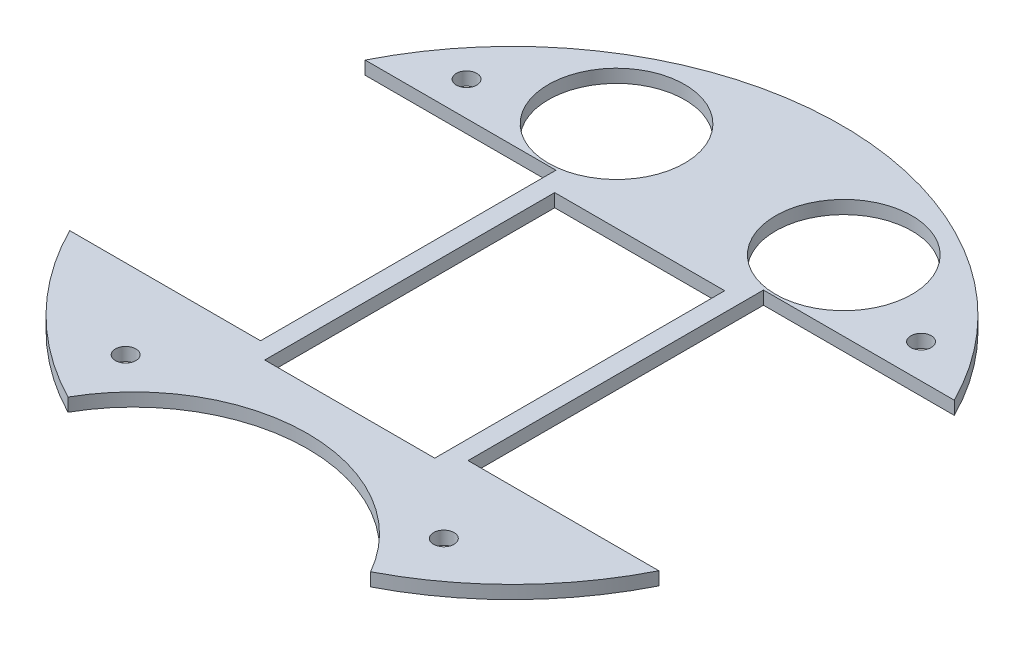
ISO-10303-21;
HEADER;
FILE_DESCRIPTION(('STEP AP214'),'2;1');
FILE_NAME('part.step','',(''),(''),'','','');
FILE_SCHEMA(('AUTOMOTIVE_DESIGN { 1 0 10303 214 1 1 1 1 }'));
ENDSEC;
DATA;
#1=APPLICATION_CONTEXT('core data for automotive mechanical design processes');
#2=APPLICATION_PROTOCOL_DEFINITION('international standard','automotive_design',2000,#1);
#3=PRODUCT_CONTEXT('',#1,'mechanical');
#4=PRODUCT('Part','Part','',(#3));
#5=PRODUCT_RELATED_PRODUCT_CATEGORY('part','',(#4));
#6=PRODUCT_DEFINITION_FORMATION('','',#4);
#7=PRODUCT_DEFINITION_CONTEXT('part definition',#1,'design');
#8=PRODUCT_DEFINITION('design','',#6,#7);
#9=PRODUCT_DEFINITION_SHAPE('','',#8);
#10=(LENGTH_UNIT() NAMED_UNIT(*) SI_UNIT(.MILLI.,.METRE.));
#11=(NAMED_UNIT(*) PLANE_ANGLE_UNIT() SI_UNIT($,.RADIAN.));
#12=(NAMED_UNIT(*) SI_UNIT($,.STERADIAN.) SOLID_ANGLE_UNIT());
#13=UNCERTAINTY_MEASURE_WITH_UNIT(LENGTH_MEASURE(1.E-05),#10,'distance_accuracy_value','');
#14=(GEOMETRIC_REPRESENTATION_CONTEXT(3) GLOBAL_UNCERTAINTY_ASSIGNED_CONTEXT((#13)) GLOBAL_UNIT_ASSIGNED_CONTEXT((#10,
#11,#12)) REPRESENTATION_CONTEXT('',''));
#15=CARTESIAN_POINT('',(0.,0.,0.));
#16=DIRECTION('',(0.,0.,1.));
#17=DIRECTION('',(1.,0.,0.));
#18=AXIS2_PLACEMENT_3D('',#15,#16,#17);
#19=CARTESIAN_POINT('',(0.,2.9,0.));
#20=DIRECTION('',(0.,-1.,0.));
#21=DIRECTION('',(0.,0.,-1.));
#22=AXIS2_PLACEMENT_3D('',#19,#20,#21);
#23=CYLINDRICAL_SURFACE('',#22,72.5);
#24=CARTESIAN_POINT('',(0.,0.,0.));
#25=DIRECTION('',(0.,1.,0.));
#26=DIRECTION('',(0.,0.,1.));
#27=AXIS2_PLACEMENT_3D('',#24,#25,#26);
#28=CIRCLE('',#27,72.5);
#29=CARTESIAN_POINT('',(33.2911053697012,0.,64.4045984636458));
#30=VERTEX_POINT('',#29);
#31=CARTESIAN_POINT('',(64.8074069840786,0.,32.4999999999999));
#32=VERTEX_POINT('',#31);
#33=EDGE_CURVE('E156',#30,#32,#28,.T.);
#34=ORIENTED_EDGE('',*,*,#33,.T.);
#35=DIRECTION('',(0.,1.,0.));
#36=VECTOR('',#35,1.);
#37=CARTESIAN_POINT('',(64.8074069840786,0.,32.4999999999999));
#38=LINE('',#37,#36);
#39=CARTESIAN_POINT('',(64.8074069840786,2.9,32.4999999999999));
#40=VERTEX_POINT('',#39);
#41=EDGE_CURVE('E231',#32,#40,#38,.T.);
#42=ORIENTED_EDGE('',*,*,#41,.T.);
#43=CARTESIAN_POINT('',(0.,2.9,0.));
#44=DIRECTION('',(0.,1.,0.));
#45=DIRECTION('',(0.,0.,1.));
#46=AXIS2_PLACEMENT_3D('',#43,#44,#45);
#47=CIRCLE('',#46,72.5);
#48=CARTESIAN_POINT('',(33.2911053697012,2.9,64.4045984636458));
#49=VERTEX_POINT('',#48);
#50=EDGE_CURVE('E165',#49,#40,#47,.T.);
#51=ORIENTED_EDGE('',*,*,#50,.F.);
#52=DIRECTION('',(0.,-1.,0.));
#53=VECTOR('',#52,1.);
#54=CARTESIAN_POINT('',(33.2911053697012,2.9,64.4045984636458));
#55=LINE('',#54,#53);
#56=EDGE_CURVE('E11',#49,#30,#55,.T.);
#57=ORIENTED_EDGE('',*,*,#56,.T.);
#58=EDGE_LOOP('',(#34,#42,#51,#57));
#59=FACE_BOUND('',#58,.T.);
#60=ADVANCED_FACE('F32',(#59),#23,.T.);
#61=CARTESIAN_POINT('',(64.8074069840786,2.9,-32.5));
#62=VERTEX_POINT('',#61);
#63=CARTESIAN_POINT('',(-64.8074069840786,2.9,-32.5));
#64=VERTEX_POINT('',#63);
#65=EDGE_CURVE('E149',#62,#64,#47,.T.);
#66=ORIENTED_EDGE('',*,*,#65,.F.);
#67=DIRECTION('',(0.,1.,0.));
#68=VECTOR('',#67,1.);
#69=CARTESIAN_POINT('',(64.8074069840786,0.,-32.5));
#70=LINE('',#69,#68);
#71=CARTESIAN_POINT('',(64.8074069840786,0.,-32.5));
#72=VERTEX_POINT('',#71);
#73=EDGE_CURVE('E136',#72,#62,#70,.T.);
#74=ORIENTED_EDGE('',*,*,#73,.F.);
#75=CARTESIAN_POINT('',(-64.8074069840786,0.,-32.5));
#76=VERTEX_POINT('',#75);
#77=EDGE_CURVE('E147',#72,#76,#28,.T.);
#78=ORIENTED_EDGE('',*,*,#77,.T.);
#79=DIRECTION('',(0.,1.,0.));
#80=VECTOR('',#79,1.);
#81=CARTESIAN_POINT('',(-64.8074069840786,0.,-32.5));
#82=LINE('',#81,#80);
#83=EDGE_CURVE('E218',#76,#64,#82,.T.);
#84=ORIENTED_EDGE('',*,*,#83,.T.);
#85=EDGE_LOOP('',(#66,#74,#78,#84));
#86=FACE_BOUND('',#85,.T.);
#87=ADVANCED_FACE('F145',(#86),#23,.T.);
#88=CARTESIAN_POINT('',(0.,2.9,83.2397996376034));
#89=DIRECTION('',(0.,-1.,0.));
#90=DIRECTION('',(0.,0.,-1.));
#91=AXIS2_PLACEMENT_3D('',#88,#89,#90);
#92=CYLINDRICAL_SURFACE('',#91,38.25);
#93=CARTESIAN_POINT('',(0.,0.,83.2397996376034));
#94=DIRECTION('',(0.,-1.,0.));
#95=DIRECTION('',(0.,0.,1.));
#96=AXIS2_PLACEMENT_3D('',#93,#94,#95);
#97=CIRCLE('',#96,38.25);
#98=CARTESIAN_POINT('',(-33.2911053697012,0.,64.4045984636458));
#99=VERTEX_POINT('',#98);
#100=EDGE_CURVE('E161',#99,#30,#97,.T.);
#101=ORIENTED_EDGE('',*,*,#100,.T.);
#102=ORIENTED_EDGE('',*,*,#56,.F.);
#103=CARTESIAN_POINT('',(0.,2.9,83.2397996376034));
#104=DIRECTION('',(0.,-1.,0.));
#105=DIRECTION('',(0.,0.,1.));
#106=AXIS2_PLACEMENT_3D('',#103,#104,#105);
#107=CIRCLE('',#106,38.25);
#108=CARTESIAN_POINT('',(-33.2911053697012,2.9,64.4045984636458));
#109=VERTEX_POINT('',#108);
#110=EDGE_CURVE('E160',#109,#49,#107,.T.);
#111=ORIENTED_EDGE('',*,*,#110,.F.);
#112=DIRECTION('',(0.,-1.,0.));
#113=VECTOR('',#112,1.);
#114=CARTESIAN_POINT('',(-33.2911053697012,2.9,64.4045984636458));
#115=LINE('',#114,#113);
#116=EDGE_CURVE('E40',#109,#99,#115,.T.);
#117=ORIENTED_EDGE('',*,*,#116,.T.);
#118=EDGE_LOOP('',(#101,#102,#111,#117));
#119=FACE_BOUND('',#118,.T.);
#120=ADVANCED_FACE('F34',(#119),#92,.F.);
#121=CARTESIAN_POINT('',(-64.8074069840786,2.9,32.4999999999999));
#122=VERTEX_POINT('',#121);
#123=EDGE_CURVE('E172',#122,#109,#47,.T.);
#124=ORIENTED_EDGE('',*,*,#123,.F.);
#125=DIRECTION('',(0.,1.,0.));
#126=VECTOR('',#125,1.);
#127=CARTESIAN_POINT('',(-64.8074069840786,0.,32.4999999999999));
#128=LINE('',#127,#126);
#129=CARTESIAN_POINT('',(-64.8074069840786,0.,32.4999999999999));
#130=VERTEX_POINT('',#129);
#131=EDGE_CURVE('E203',#130,#122,#128,.T.);
#132=ORIENTED_EDGE('',*,*,#131,.F.);
#133=EDGE_CURVE('E157',#130,#99,#28,.T.);
#134=ORIENTED_EDGE('',*,*,#133,.T.);
#135=ORIENTED_EDGE('',*,*,#116,.F.);
#136=EDGE_LOOP('',(#124,#132,#134,#135));
#137=FACE_BOUND('',#136,.T.);
#138=ADVANCED_FACE('F299',(#137),#23,.T.);
#139=CARTESIAN_POINT('',(0.,2.9,41.6198998188017));
#140=DIRECTION('',(0.,1.,0.));
#141=DIRECTION('',(0.,0.,1.));
#142=AXIS2_PLACEMENT_3D('',#139,#140,#141);
#143=PLANE('',#142);
#144=CARTESIAN_POINT('',(-35.,2.9,50.));
#145=DIRECTION('',(0.,1.,0.));
#146=DIRECTION('',(0.,0.,1.));
#147=AXIS2_PLACEMENT_3D('',#144,#145,#146);
#148=CIRCLE('',#147,2.25);
#149=CARTESIAN_POINT('',(-35.,2.9,52.25));
#150=VERTEX_POINT('',#149);
#151=EDGE_CURVE('E281',#150,#150,#148,.T.);
#152=ORIENTED_EDGE('',*,*,#151,.F.);
#153=EDGE_LOOP('',(#152));
#154=FACE_BOUND('',#153,.T.);
#155=CARTESIAN_POINT('',(-50.,2.9,-40.));
#156=DIRECTION('',(0.,1.,0.));
#157=DIRECTION('',(0.,0.,1.));
#158=AXIS2_PLACEMENT_3D('',#155,#156,#157);
#159=CIRCLE('',#158,2.25);
#160=CARTESIAN_POINT('',(-50.,2.9,-37.75));
#161=VERTEX_POINT('',#160);
#162=EDGE_CURVE('E275',#161,#161,#159,.T.);
#163=ORIENTED_EDGE('',*,*,#162,.F.);
#164=EDGE_LOOP('',(#163));
#165=FACE_BOUND('',#164,.T.);
#166=CARTESIAN_POINT('',(50.,2.9,-40.));
#167=DIRECTION('',(0.,1.,0.));
#168=DIRECTION('',(0.,0.,1.));
#169=AXIS2_PLACEMENT_3D('',#166,#167,#168);
#170=CIRCLE('',#169,2.25);
#171=CARTESIAN_POINT('',(50.,2.9,-37.75));
#172=VERTEX_POINT('',#171);
#173=EDGE_CURVE('E269',#172,#172,#170,.T.);
#174=ORIENTED_EDGE('',*,*,#173,.F.);
#175=EDGE_LOOP('',(#174));
#176=FACE_BOUND('',#175,.T.);
#177=CARTESIAN_POINT('',(35.,2.9,50.));
#178=DIRECTION('',(0.,1.,0.));
#179=DIRECTION('',(0.,0.,1.));
#180=AXIS2_PLACEMENT_3D('',#177,#178,#179);
#181=CIRCLE('',#180,2.25);
#182=CARTESIAN_POINT('',(35.,2.9,52.25));
#183=VERTEX_POINT('',#182);
#184=EDGE_CURVE('E263',#183,#183,#181,.T.);
#185=ORIENTED_EDGE('',*,*,#184,.F.);
#186=EDGE_LOOP('',(#185));
#187=FACE_BOUND('',#186,.T.);
#188=CARTESIAN_POINT('',(-25.,2.9,-48.));
#189=DIRECTION('',(0.,1.,0.));
#190=DIRECTION('',(0.,0.,1.));
#191=AXIS2_PLACEMENT_3D('',#188,#189,#190);
#192=CIRCLE('',#191,15.);
#193=CARTESIAN_POINT('',(-25.,2.9,-33.));
#194=VERTEX_POINT('',#193);
#195=EDGE_CURVE('E257',#194,#194,#192,.T.);
#196=ORIENTED_EDGE('',*,*,#195,.F.);
#197=EDGE_LOOP('',(#196));
#198=FACE_BOUND('',#197,.T.);
#199=CARTESIAN_POINT('',(25.,2.9,-48.));
#200=DIRECTION('',(0.,1.,0.));
#201=DIRECTION('',(0.,0.,1.));
#202=AXIS2_PLACEMENT_3D('',#199,#200,#201);
#203=CIRCLE('',#202,15.);
#204=CARTESIAN_POINT('',(25.,2.9,-33.));
#205=VERTEX_POINT('',#204);
#206=EDGE_CURVE('E251',#205,#205,#203,.T.);
#207=ORIENTED_EDGE('',*,*,#206,.F.);
#208=EDGE_LOOP('',(#207));
#209=FACE_BOUND('',#208,.T.);
#210=DIRECTION('',(1.,0.,0.));
#211=VECTOR('',#210,1.);
#212=CARTESIAN_POINT('',(64.8074069840786,2.9,32.4999999999999));
#213=LINE('',#212,#211);
#214=CARTESIAN_POINT('',(22.8299999999999,2.9,32.4999999999999));
#215=VERTEX_POINT('',#214);
#216=EDGE_CURVE('E141',#215,#40,#213,.T.);
#217=ORIENTED_EDGE('',*,*,#216,.F.);
#218=DIRECTION('',(0.,0.,1.));
#219=VECTOR('',#218,1.);
#220=CARTESIAN_POINT('',(22.8299999999999,2.9,32.4999999999999));
#221=LINE('',#220,#219);
#222=CARTESIAN_POINT('',(22.8299999999999,2.9,-32.5));
#223=VERTEX_POINT('',#222);
#224=EDGE_CURVE('E242',#223,#215,#221,.T.);
#225=ORIENTED_EDGE('',*,*,#224,.F.);
#226=DIRECTION('',(-1.,0.,0.));
#227=VECTOR('',#226,1.);
#228=CARTESIAN_POINT('',(64.8074069840786,2.9,-32.5));
#229=LINE('',#228,#227);
#230=EDGE_CURVE('E245',#62,#223,#229,.T.);
#231=ORIENTED_EDGE('',*,*,#230,.F.);
#232=ORIENTED_EDGE('',*,*,#65,.T.);
#233=DIRECTION('',(-1.,0.,0.));
#234=VECTOR('',#233,1.);
#235=CARTESIAN_POINT('',(-64.8074069840786,2.9,-32.5));
#236=LINE('',#235,#234);
#237=CARTESIAN_POINT('',(-22.8299999999999,2.9,-32.5));
#238=VERTEX_POINT('',#237);
#239=EDGE_CURVE('E221',#238,#64,#236,.T.);
#240=ORIENTED_EDGE('',*,*,#239,.F.);
#241=DIRECTION('',(0.,0.,-1.));
#242=VECTOR('',#241,1.);
#243=CARTESIAN_POINT('',(-22.8299999999999,2.9,32.4999999999999));
#244=LINE('',#243,#242);
#245=CARTESIAN_POINT('',(-22.8299999999999,2.9,32.4999999999999));
#246=VERTEX_POINT('',#245);
#247=EDGE_CURVE('E225',#246,#238,#244,.T.);
#248=ORIENTED_EDGE('',*,*,#247,.F.);
#249=DIRECTION('',(1.,0.,0.));
#250=VECTOR('',#249,1.);
#251=CARTESIAN_POINT('',(-34.6299999999999,2.9,32.5));
#252=LINE('',#251,#250);
#253=EDGE_CURVE('E228',#122,#246,#252,.T.);
#254=ORIENTED_EDGE('',*,*,#253,.F.);
#255=ORIENTED_EDGE('',*,*,#123,.T.);
#256=ORIENTED_EDGE('',*,*,#110,.T.);
#257=ORIENTED_EDGE('',*,*,#50,.T.);
#258=EDGE_LOOP('',(#217,#225,#231,#232,#240,#248,#254,#255,#256,#257));
#259=FACE_BOUND('',#258,.T.);
#260=DIRECTION('',(0.,0.,1.));
#261=VECTOR('',#260,1.);
#262=CARTESIAN_POINT('',(-18.7,2.9,35.7));
#263=LINE('',#262,#261);
#264=CARTESIAN_POINT('',(-18.7,2.9,-28.1));
#265=VERTEX_POINT('',#264);
#266=CARTESIAN_POINT('',(-18.7,2.9,35.7));
#267=VERTEX_POINT('',#266);
#268=EDGE_CURVE('E201',#265,#267,#263,.T.);
#269=ORIENTED_EDGE('',*,*,#268,.F.);
#270=DIRECTION('',(-1.,0.,0.));
#271=VECTOR('',#270,1.);
#272=CARTESIAN_POINT('',(-18.7,2.9,-28.1));
#273=LINE('',#272,#271);
#274=CARTESIAN_POINT('',(18.7,2.9,-28.1));
#275=VERTEX_POINT('',#274);
#276=EDGE_CURVE('E191',#275,#265,#273,.T.);
#277=ORIENTED_EDGE('',*,*,#276,.F.);
#278=DIRECTION('',(0.,0.,-1.));
#279=VECTOR('',#278,1.);
#280=CARTESIAN_POINT('',(18.7,2.9,35.7));
#281=LINE('',#280,#279);
#282=CARTESIAN_POINT('',(18.7,2.9,35.7));
#283=VERTEX_POINT('',#282);
#284=EDGE_CURVE('E195',#283,#275,#281,.T.);
#285=ORIENTED_EDGE('',*,*,#284,.F.);
#286=DIRECTION('',(1.,0.,0.));
#287=VECTOR('',#286,1.);
#288=CARTESIAN_POINT('',(-18.7,2.9,35.7));
#289=LINE('',#288,#287);
#290=EDGE_CURVE('E198',#267,#283,#289,.T.);
#291=ORIENTED_EDGE('',*,*,#290,.F.);
#292=EDGE_LOOP('',(#269,#277,#285,#291));
#293=FACE_BOUND('',#292,.T.);
#294=ADVANCED_FACE('F296',(#154,#165,#176,#187,#198,#209,#259,#293),#143,.T.);
#295=CARTESIAN_POINT('',(0.,0.,41.6198998188017));
#296=DIRECTION('',(0.,1.,0.));
#297=DIRECTION('',(0.,0.,1.));
#298=AXIS2_PLACEMENT_3D('',#295,#296,#297);
#299=PLANE('',#298);
#300=CARTESIAN_POINT('',(-35.,0.,50.));
#301=DIRECTION('',(0.,1.,0.));
#302=DIRECTION('',(0.,0.,1.));
#303=AXIS2_PLACEMENT_3D('',#300,#301,#302);
#304=CIRCLE('',#303,2.25);
#305=CARTESIAN_POINT('',(-35.,0.,52.25));
#306=VERTEX_POINT('',#305);
#307=EDGE_CURVE('E266',#306,#306,#304,.T.);
#308=ORIENTED_EDGE('',*,*,#307,.T.);
#309=EDGE_LOOP('',(#308));
#310=FACE_BOUND('',#309,.T.);
#311=CARTESIAN_POINT('',(-50.,0.,-40.));
#312=DIRECTION('',(0.,1.,0.));
#313=DIRECTION('',(0.,0.,1.));
#314=AXIS2_PLACEMENT_3D('',#311,#312,#313);
#315=CIRCLE('',#314,2.25);
#316=CARTESIAN_POINT('',(-50.,0.,-37.75));
#317=VERTEX_POINT('',#316);
#318=EDGE_CURVE('E278',#317,#317,#315,.T.);
#319=ORIENTED_EDGE('',*,*,#318,.T.);
#320=EDGE_LOOP('',(#319));
#321=FACE_BOUND('',#320,.T.);
#322=CARTESIAN_POINT('',(50.,0.,-40.));
#323=DIRECTION('',(0.,1.,0.));
#324=DIRECTION('',(0.,0.,1.));
#325=AXIS2_PLACEMENT_3D('',#322,#323,#324);
#326=CIRCLE('',#325,2.25);
#327=CARTESIAN_POINT('',(50.,0.,-37.75));
#328=VERTEX_POINT('',#327);
#329=EDGE_CURVE('E272',#328,#328,#326,.T.);
#330=ORIENTED_EDGE('',*,*,#329,.T.);
#331=EDGE_LOOP('',(#330));
#332=FACE_BOUND('',#331,.T.);
#333=CARTESIAN_POINT('',(35.,0.,50.));
#334=DIRECTION('',(0.,1.,0.));
#335=DIRECTION('',(0.,0.,1.));
#336=AXIS2_PLACEMENT_3D('',#333,#334,#335);
#337=CIRCLE('',#336,2.25);
#338=CARTESIAN_POINT('',(35.,0.,52.25));
#339=VERTEX_POINT('',#338);
#340=EDGE_CURVE('E260',#339,#339,#337,.T.);
#341=ORIENTED_EDGE('',*,*,#340,.T.);
#342=EDGE_LOOP('',(#341));
#343=FACE_BOUND('',#342,.T.);
#344=CARTESIAN_POINT('',(-25.,0.,-48.));
#345=DIRECTION('',(0.,1.,0.));
#346=DIRECTION('',(0.,0.,1.));
#347=AXIS2_PLACEMENT_3D('',#344,#345,#346);
#348=CIRCLE('',#347,15.);
#349=CARTESIAN_POINT('',(-25.,0.,-33.));
#350=VERTEX_POINT('',#349);
#351=EDGE_CURVE('E254',#350,#350,#348,.T.);
#352=ORIENTED_EDGE('',*,*,#351,.T.);
#353=EDGE_LOOP('',(#352));
#354=FACE_BOUND('',#353,.T.);
#355=CARTESIAN_POINT('',(25.,0.,-48.));
#356=DIRECTION('',(0.,1.,0.));
#357=DIRECTION('',(0.,0.,1.));
#358=AXIS2_PLACEMENT_3D('',#355,#356,#357);
#359=CIRCLE('',#358,15.);
#360=CARTESIAN_POINT('',(25.,0.,-33.));
#361=VERTEX_POINT('',#360);
#362=EDGE_CURVE('E247',#361,#361,#359,.T.);
#363=ORIENTED_EDGE('',*,*,#362,.T.);
#364=EDGE_LOOP('',(#363));
#365=FACE_BOUND('',#364,.T.);
#366=DIRECTION('',(-1.,0.,0.));
#367=VECTOR('',#366,1.);
#368=CARTESIAN_POINT('',(-18.7,0.,-28.1));
#369=LINE('',#368,#367);
#370=CARTESIAN_POINT('',(18.7,0.,-28.1));
#371=VERTEX_POINT('',#370);
#372=CARTESIAN_POINT('',(-18.7,0.,-28.1));
#373=VERTEX_POINT('',#372);
#374=EDGE_CURVE('E185',#371,#373,#369,.T.);
#375=ORIENTED_EDGE('',*,*,#374,.T.);
#376=DIRECTION('',(0.,0.,1.));
#377=VECTOR('',#376,1.);
#378=CARTESIAN_POINT('',(-18.7,0.,35.7));
#379=LINE('',#378,#377);
#380=CARTESIAN_POINT('',(-18.7,0.,35.7));
#381=VERTEX_POINT('',#380);
#382=EDGE_CURVE('E194',#373,#381,#379,.T.);
#383=ORIENTED_EDGE('',*,*,#382,.T.);
#384=DIRECTION('',(1.,0.,0.));
#385=VECTOR('',#384,1.);
#386=CARTESIAN_POINT('',(-18.7,0.,35.7));
#387=LINE('',#386,#385);
#388=CARTESIAN_POINT('',(18.7,0.,35.7));
#389=VERTEX_POINT('',#388);
#390=EDGE_CURVE('E209',#381,#389,#387,.T.);
#391=ORIENTED_EDGE('',*,*,#390,.T.);
#392=DIRECTION('',(0.,0.,-1.));
#393=VECTOR('',#392,1.);
#394=CARTESIAN_POINT('',(18.7,0.,35.7));
#395=LINE('',#394,#393);
#396=EDGE_CURVE('E206',#389,#371,#395,.T.);
#397=ORIENTED_EDGE('',*,*,#396,.T.);
#398=EDGE_LOOP('',(#375,#383,#391,#397));
#399=FACE_BOUND('',#398,.T.);
#400=DIRECTION('',(0.,0.,1.));
#401=VECTOR('',#400,1.);
#402=CARTESIAN_POINT('',(22.8299999999999,0.,32.4999999999999));
#403=LINE('',#402,#401);
#404=CARTESIAN_POINT('',(22.8299999999999,0.,-32.5));
#405=VERTEX_POINT('',#404);
#406=CARTESIAN_POINT('',(22.8299999999999,0.,32.4999999999999));
#407=VERTEX_POINT('',#406);
#408=EDGE_CURVE('E47',#405,#407,#403,.T.);
#409=ORIENTED_EDGE('',*,*,#408,.T.);
#410=DIRECTION('',(1.,0.,0.));
#411=VECTOR('',#410,1.);
#412=CARTESIAN_POINT('',(34.6299999999999,0.,32.5));
#413=LINE('',#412,#411);
#414=EDGE_CURVE('E150',#407,#32,#413,.T.);
#415=ORIENTED_EDGE('',*,*,#414,.T.);
#416=ORIENTED_EDGE('',*,*,#33,.F.);
#417=ORIENTED_EDGE('',*,*,#100,.F.);
#418=ORIENTED_EDGE('',*,*,#133,.F.);
#419=DIRECTION('',(1.,0.,0.));
#420=VECTOR('',#419,1.);
#421=CARTESIAN_POINT('',(-64.8074069840786,0.,32.4999999999999));
#422=LINE('',#421,#420);
#423=CARTESIAN_POINT('',(-22.8299999999999,0.,32.4999999999999));
#424=VERTEX_POINT('',#423);
#425=EDGE_CURVE('E224',#130,#424,#422,.T.);
#426=ORIENTED_EDGE('',*,*,#425,.T.);
#427=DIRECTION('',(0.,0.,-1.));
#428=VECTOR('',#427,1.);
#429=CARTESIAN_POINT('',(-22.8299999999999,0.,32.4999999999999));
#430=LINE('',#429,#428);
#431=CARTESIAN_POINT('',(-22.8299999999999,0.,-32.5));
#432=VERTEX_POINT('',#431);
#433=EDGE_CURVE('E55',#424,#432,#430,.T.);
#434=ORIENTED_EDGE('',*,*,#433,.T.);
#435=DIRECTION('',(-1.,0.,0.));
#436=VECTOR('',#435,1.);
#437=CARTESIAN_POINT('',(-64.8074069840786,0.,-32.5));
#438=LINE('',#437,#436);
#439=EDGE_CURVE('E155',#432,#76,#438,.T.);
#440=ORIENTED_EDGE('',*,*,#439,.T.);
#441=ORIENTED_EDGE('',*,*,#77,.F.);
#442=DIRECTION('',(-1.,0.,0.));
#443=VECTOR('',#442,1.);
#444=CARTESIAN_POINT('',(64.8074069840786,0.,-32.5));
#445=LINE('',#444,#443);
#446=EDGE_CURVE('E132',#72,#405,#445,.T.);
#447=ORIENTED_EDGE('',*,*,#446,.T.);
#448=EDGE_LOOP('',(#409,#415,#416,#417,#418,#426,#434,#440,#441,#447));
#449=FACE_BOUND('',#448,.T.);
#450=ADVANCED_FACE('F153',(#310,#321,#332,#343,#354,#365,#399,#449),#299,.F.);
#451=CARTESIAN_POINT('',(-18.7,0.,35.7));
#452=DIRECTION('',(-1.,0.,0.));
#453=DIRECTION('',(0.,0.,1.));
#454=AXIS2_PLACEMENT_3D('',#451,#452,#453);
#455=PLANE('',#454);
#456=ORIENTED_EDGE('',*,*,#268,.T.);
#457=DIRECTION('',(0.,1.,0.));
#458=VECTOR('',#457,1.);
#459=CARTESIAN_POINT('',(-18.7,0.,35.7));
#460=LINE('',#459,#458);
#461=EDGE_CURVE('E181',#381,#267,#460,.T.);
#462=ORIENTED_EDGE('',*,*,#461,.F.);
#463=ORIENTED_EDGE('',*,*,#382,.F.);
#464=DIRECTION('',(0.,1.,0.));
#465=VECTOR('',#464,1.);
#466=CARTESIAN_POINT('',(-18.7,0.,-28.1));
#467=LINE('',#466,#465);
#468=EDGE_CURVE('E189',#373,#265,#467,.T.);
#469=ORIENTED_EDGE('',*,*,#468,.T.);
#470=EDGE_LOOP('',(#456,#462,#463,#469));
#471=FACE_BOUND('',#470,.T.);
#472=ADVANCED_FACE('F317',(#471),#455,.F.);
#473=CARTESIAN_POINT('',(-18.7,0.,-28.1));
#474=DIRECTION('',(0.,0.,-1.));
#475=DIRECTION('',(-1.,0.,0.));
#476=AXIS2_PLACEMENT_3D('',#473,#474,#475);
#477=PLANE('',#476);
#478=ORIENTED_EDGE('',*,*,#276,.T.);
#479=ORIENTED_EDGE('',*,*,#468,.F.);
#480=ORIENTED_EDGE('',*,*,#374,.F.);
#481=DIRECTION('',(0.,1.,0.));
#482=VECTOR('',#481,1.);
#483=CARTESIAN_POINT('',(18.7,0.,-28.1));
#484=LINE('',#483,#482);
#485=EDGE_CURVE('E187',#371,#275,#484,.T.);
#486=ORIENTED_EDGE('',*,*,#485,.T.);
#487=EDGE_LOOP('',(#478,#479,#480,#486));
#488=FACE_BOUND('',#487,.T.);
#489=ADVANCED_FACE('F326',(#488),#477,.F.);
#490=CARTESIAN_POINT('',(18.7,0.,35.7));
#491=DIRECTION('',(1.,0.,0.));
#492=DIRECTION('',(0.,0.,-1.));
#493=AXIS2_PLACEMENT_3D('',#490,#491,#492);
#494=PLANE('',#493);
#495=ORIENTED_EDGE('',*,*,#284,.T.);
#496=ORIENTED_EDGE('',*,*,#485,.F.);
#497=ORIENTED_EDGE('',*,*,#396,.F.);
#498=DIRECTION('',(0.,1.,0.));
#499=VECTOR('',#498,1.);
#500=CARTESIAN_POINT('',(18.7,0.,35.7));
#501=LINE('',#500,#499);
#502=EDGE_CURVE('E184',#389,#283,#501,.T.);
#503=ORIENTED_EDGE('',*,*,#502,.T.);
#504=EDGE_LOOP('',(#495,#496,#497,#503));
#505=FACE_BOUND('',#504,.T.);
#506=ADVANCED_FACE('F328',(#505),#494,.F.);
#507=CARTESIAN_POINT('',(-18.7,0.,35.7));
#508=DIRECTION('',(0.,0.,1.));
#509=DIRECTION('',(1.,0.,0.));
#510=AXIS2_PLACEMENT_3D('',#507,#508,#509);
#511=PLANE('',#510);
#512=ORIENTED_EDGE('',*,*,#290,.T.);
#513=ORIENTED_EDGE('',*,*,#502,.F.);
#514=ORIENTED_EDGE('',*,*,#390,.F.);
#515=ORIENTED_EDGE('',*,*,#461,.T.);
#516=EDGE_LOOP('',(#512,#513,#514,#515));
#517=FACE_BOUND('',#516,.T.);
#518=ADVANCED_FACE('F321',(#517),#511,.F.);
#519=CARTESIAN_POINT('',(-64.8074069840786,0.,-32.5));
#520=DIRECTION('',(0.,0.,-1.));
#521=DIRECTION('',(-1.,0.,0.));
#522=AXIS2_PLACEMENT_3D('',#519,#520,#521);
#523=PLANE('',#522);
#524=ORIENTED_EDGE('',*,*,#239,.T.);
#525=ORIENTED_EDGE('',*,*,#83,.F.);
#526=ORIENTED_EDGE('',*,*,#439,.F.);
#527=DIRECTION('',(0.,1.,0.));
#528=VECTOR('',#527,1.);
#529=CARTESIAN_POINT('',(-22.8299999999999,0.,-32.5));
#530=LINE('',#529,#528);
#531=EDGE_CURVE('E216',#432,#238,#530,.T.);
#532=ORIENTED_EDGE('',*,*,#531,.T.);
#533=EDGE_LOOP('',(#524,#525,#526,#532));
#534=FACE_BOUND('',#533,.T.);
#535=ADVANCED_FACE('F335',(#534),#523,.F.);
#536=CARTESIAN_POINT('',(-22.8299999999999,0.,32.4999999999999));
#537=DIRECTION('',(1.,0.,0.));
#538=DIRECTION('',(0.,0.,-1.));
#539=AXIS2_PLACEMENT_3D('',#536,#537,#538);
#540=PLANE('',#539);
#541=ORIENTED_EDGE('',*,*,#247,.T.);
#542=ORIENTED_EDGE('',*,*,#531,.F.);
#543=ORIENTED_EDGE('',*,*,#433,.F.);
#544=DIRECTION('',(0.,1.,0.));
#545=VECTOR('',#544,1.);
#546=CARTESIAN_POINT('',(-22.8299999999999,0.,32.4999999999999));
#547=LINE('',#546,#545);
#548=EDGE_CURVE('E214',#424,#246,#547,.T.);
#549=ORIENTED_EDGE('',*,*,#548,.T.);
#550=EDGE_LOOP('',(#541,#542,#543,#549));
#551=FACE_BOUND('',#550,.T.);
#552=ADVANCED_FACE('F357',(#551),#540,.F.);
#553=CARTESIAN_POINT('',(-34.6299999999999,0.,32.5));
#554=DIRECTION('',(0.,0.,1.));
#555=DIRECTION('',(1.,0.,0.));
#556=AXIS2_PLACEMENT_3D('',#553,#554,#555);
#557=PLANE('',#556);
#558=ORIENTED_EDGE('',*,*,#253,.T.);
#559=ORIENTED_EDGE('',*,*,#548,.F.);
#560=ORIENTED_EDGE('',*,*,#425,.F.);
#561=ORIENTED_EDGE('',*,*,#131,.T.);
#562=EDGE_LOOP('',(#558,#559,#560,#561));
#563=FACE_BOUND('',#562,.T.);
#564=ADVANCED_FACE('F355',(#563),#557,.F.);
#565=CARTESIAN_POINT('',(64.8074069840786,0.,32.4999999999999));
#566=DIRECTION('',(0.,0.,1.));
#567=DIRECTION('',(1.,0.,0.));
#568=AXIS2_PLACEMENT_3D('',#565,#566,#567);
#569=PLANE('',#568);
#570=ORIENTED_EDGE('',*,*,#216,.T.);
#571=ORIENTED_EDGE('',*,*,#41,.F.);
#572=ORIENTED_EDGE('',*,*,#414,.F.);
#573=DIRECTION('',(0.,1.,0.));
#574=VECTOR('',#573,1.);
#575=CARTESIAN_POINT('',(22.8299999999999,0.,32.4999999999999));
#576=LINE('',#575,#574);
#577=EDGE_CURVE('E237',#407,#215,#576,.T.);
#578=ORIENTED_EDGE('',*,*,#577,.T.);
#579=EDGE_LOOP('',(#570,#571,#572,#578));
#580=FACE_BOUND('',#579,.T.);
#581=ADVANCED_FACE('F353',(#580),#569,.F.);
#582=CARTESIAN_POINT('',(22.8299999999999,0.,32.4999999999999));
#583=DIRECTION('',(-1.,0.,0.));
#584=DIRECTION('',(0.,0.,1.));
#585=AXIS2_PLACEMENT_3D('',#582,#583,#584);
#586=PLANE('',#585);
#587=ORIENTED_EDGE('',*,*,#224,.T.);
#588=ORIENTED_EDGE('',*,*,#577,.F.);
#589=ORIENTED_EDGE('',*,*,#408,.F.);
#590=DIRECTION('',(0.,1.,0.));
#591=VECTOR('',#590,1.);
#592=CARTESIAN_POINT('',(22.8299999999999,0.,-32.5));
#593=LINE('',#592,#591);
#594=EDGE_CURVE('E138',#405,#223,#593,.T.);
#595=ORIENTED_EDGE('',*,*,#594,.T.);
#596=EDGE_LOOP('',(#587,#588,#589,#595));
#597=FACE_BOUND('',#596,.T.);
#598=ADVANCED_FACE('F373',(#597),#586,.F.);
#599=CARTESIAN_POINT('',(64.8074069840786,0.,-32.5));
#600=DIRECTION('',(0.,0.,-1.));
#601=DIRECTION('',(-1.,0.,0.));
#602=AXIS2_PLACEMENT_3D('',#599,#600,#601);
#603=PLANE('',#602);
#604=ORIENTED_EDGE('',*,*,#230,.T.);
#605=ORIENTED_EDGE('',*,*,#594,.F.);
#606=ORIENTED_EDGE('',*,*,#446,.F.);
#607=ORIENTED_EDGE('',*,*,#73,.T.);
#608=EDGE_LOOP('',(#604,#605,#606,#607));
#609=FACE_BOUND('',#608,.T.);
#610=ADVANCED_FACE('F135',(#609),#603,.F.);
#611=CARTESIAN_POINT('',(25.,0.,-48.));
#612=DIRECTION('',(0.,1.,0.));
#613=DIRECTION('',(0.,0.,1.));
#614=AXIS2_PLACEMENT_3D('',#611,#612,#613);
#615=CYLINDRICAL_SURFACE('',#614,15.);
#616=ORIENTED_EDGE('',*,*,#362,.F.);
#617=EDGE_LOOP('',(#616));
#618=FACE_BOUND('',#617,.T.);
#619=ORIENTED_EDGE('',*,*,#206,.T.);
#620=EDGE_LOOP('',(#619));
#621=FACE_BOUND('',#620,.T.);
#622=ADVANCED_FACE('F379',(#618,#621),#615,.F.);
#623=CARTESIAN_POINT('',(-25.,0.,-48.));
#624=DIRECTION('',(0.,1.,0.));
#625=DIRECTION('',(0.,0.,1.));
#626=AXIS2_PLACEMENT_3D('',#623,#624,#625);
#627=CYLINDRICAL_SURFACE('',#626,15.);
#628=ORIENTED_EDGE('',*,*,#351,.F.);
#629=EDGE_LOOP('',(#628));
#630=FACE_BOUND('',#629,.T.);
#631=ORIENTED_EDGE('',*,*,#195,.T.);
#632=EDGE_LOOP('',(#631));
#633=FACE_BOUND('',#632,.T.);
#634=ADVANCED_FACE('F382',(#630,#633),#627,.F.);
#635=CARTESIAN_POINT('',(35.,0.,50.));
#636=DIRECTION('',(0.,1.,0.));
#637=DIRECTION('',(0.,0.,1.));
#638=AXIS2_PLACEMENT_3D('',#635,#636,#637);
#639=CYLINDRICAL_SURFACE('',#638,2.25);
#640=ORIENTED_EDGE('',*,*,#340,.F.);
#641=EDGE_LOOP('',(#640));
#642=FACE_BOUND('',#641,.T.);
#643=ORIENTED_EDGE('',*,*,#184,.T.);
#644=EDGE_LOOP('',(#643));
#645=FACE_BOUND('',#644,.T.);
#646=ADVANCED_FACE('F386',(#642,#645),#639,.F.);
#647=CARTESIAN_POINT('',(50.,0.,-40.));
#648=DIRECTION('',(0.,1.,0.));
#649=DIRECTION('',(0.,0.,1.));
#650=AXIS2_PLACEMENT_3D('',#647,#648,#649);
#651=CYLINDRICAL_SURFACE('',#650,2.25);
#652=ORIENTED_EDGE('',*,*,#329,.F.);
#653=EDGE_LOOP('',(#652));
#654=FACE_BOUND('',#653,.T.);
#655=ORIENTED_EDGE('',*,*,#173,.T.);
#656=EDGE_LOOP('',(#655));
#657=FACE_BOUND('',#656,.T.);
#658=ADVANCED_FACE('F390',(#654,#657),#651,.F.);
#659=CARTESIAN_POINT('',(-50.,0.,-40.));
#660=DIRECTION('',(0.,1.,0.));
#661=DIRECTION('',(0.,0.,1.));
#662=AXIS2_PLACEMENT_3D('',#659,#660,#661);
#663=CYLINDRICAL_SURFACE('',#662,2.25);
#664=ORIENTED_EDGE('',*,*,#318,.F.);
#665=EDGE_LOOP('',(#664));
#666=FACE_BOUND('',#665,.T.);
#667=ORIENTED_EDGE('',*,*,#162,.T.);
#668=EDGE_LOOP('',(#667));
#669=FACE_BOUND('',#668,.T.);
#670=ADVANCED_FACE('F292',(#666,#669),#663,.F.);
#671=CARTESIAN_POINT('',(-35.,0.,50.));
#672=DIRECTION('',(0.,1.,0.));
#673=DIRECTION('',(0.,0.,1.));
#674=AXIS2_PLACEMENT_3D('',#671,#672,#673);
#675=CYLINDRICAL_SURFACE('',#674,2.25);
#676=ORIENTED_EDGE('',*,*,#307,.F.);
#677=EDGE_LOOP('',(#676));
#678=FACE_BOUND('',#677,.T.);
#679=ORIENTED_EDGE('',*,*,#151,.T.);
#680=EDGE_LOOP('',(#679));
#681=FACE_BOUND('',#680,.T.);
#682=ADVANCED_FACE('F289',(#678,#681),#675,.F.);
#683=CLOSED_SHELL('',(#60,#87,#120,#138,#294,#450,#472,#489,#506,#518,#535,#552,#564,#581,#598,
#610,#622,#634,#646,#658,#670,#682));
#684=MANIFOLD_SOLID_BREP('B2',#683);
#685=ADVANCED_BREP_SHAPE_REPRESENTATION('',(#18,#684),#14);
#686=SHAPE_DEFINITION_REPRESENTATION(#9,#685);
ENDSEC;
END-ISO-10303-21;
